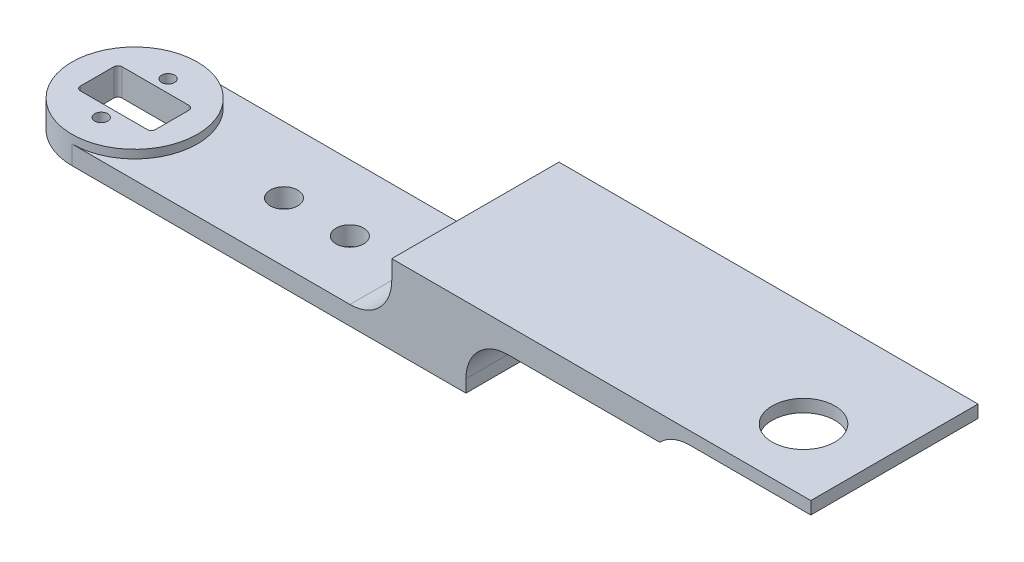
ISO-10303-21;
HEADER;
FILE_DESCRIPTION(('STEP AP214'),'2;1');
FILE_NAME('part.step','',(''),(''),'','','');
FILE_SCHEMA(('AUTOMOTIVE_DESIGN { 1 0 10303 214 1 1 1 1 }'));
ENDSEC;
DATA;
#1=APPLICATION_CONTEXT('core data for automotive mechanical design processes');
#2=APPLICATION_PROTOCOL_DEFINITION('international standard','automotive_design',2000,#1);
#3=PRODUCT_CONTEXT('',#1,'mechanical');
#4=PRODUCT('Part','Part','',(#3));
#5=PRODUCT_RELATED_PRODUCT_CATEGORY('part','',(#4));
#6=PRODUCT_DEFINITION_FORMATION('','',#4);
#7=PRODUCT_DEFINITION_CONTEXT('part definition',#1,'design');
#8=PRODUCT_DEFINITION('design','',#6,#7);
#9=PRODUCT_DEFINITION_SHAPE('','',#8);
#10=(LENGTH_UNIT() NAMED_UNIT(*) SI_UNIT(.MILLI.,.METRE.));
#11=(NAMED_UNIT(*) PLANE_ANGLE_UNIT() SI_UNIT($,.RADIAN.));
#12=(NAMED_UNIT(*) SI_UNIT($,.STERADIAN.) SOLID_ANGLE_UNIT());
#13=UNCERTAINTY_MEASURE_WITH_UNIT(LENGTH_MEASURE(1.E-05),#10,'distance_accuracy_value','');
#14=(GEOMETRIC_REPRESENTATION_CONTEXT(3) GLOBAL_UNCERTAINTY_ASSIGNED_CONTEXT((#13)) GLOBAL_UNIT_ASSIGNED_CONTEXT((#10,
#11,#12)) REPRESENTATION_CONTEXT('',''));
#15=CARTESIAN_POINT('',(0.,0.,0.));
#16=DIRECTION('',(0.,0.,1.));
#17=DIRECTION('',(1.,0.,0.));
#18=AXIS2_PLACEMENT_3D('',#15,#16,#17);
#19=CARTESIAN_POINT('',(-78.0013072163729,-18.5530526473976,147.487506354902));
#20=DIRECTION('',(0.,1.,1.36566002242615E-12));
#21=DIRECTION('',(1.,0.,0.));
#22=AXIS2_PLACEMENT_3D('',#19,#20,#21);
#23=PLANE('',#22);
#24=CARTESIAN_POINT('',(-25.6970909577959,-18.5530526473987,148.317146574787));
#25=DIRECTION('',(0.,-1.,-1.36566002242615E-12));
#26=DIRECTION('',(-1.,0.,0.));
#27=AXIS2_PLACEMENT_3D('',#24,#25,#26);
#28=CIRCLE('',#27,3.3);
#29=CARTESIAN_POINT('',(-28.9970909577959,-18.5530526473987,148.317146574787));
#30=VERTEX_POINT('',#29);
#31=EDGE_CURVE('E618',#30,#30,#28,.T.);
#32=ORIENTED_EDGE('',*,*,#31,.F.);
#33=EDGE_LOOP('',(#32));
#34=FACE_BOUND('',#33,.T.);
#35=CARTESIAN_POINT('',(-41.4543417426524,-18.5530526473987,148.317146574787));
#36=DIRECTION('',(0.,-1.,-1.36566002242615E-12));
#37=DIRECTION('',(-1.,0.,0.));
#38=AXIS2_PLACEMENT_3D('',#35,#36,#37);
#39=CIRCLE('',#38,3.30000000000001);
#40=CARTESIAN_POINT('',(-44.7543417426524,-18.5530526473987,148.317146574787));
#41=VERTEX_POINT('',#40);
#42=EDGE_CURVE('E383',#41,#41,#39,.T.);
#43=ORIENTED_EDGE('',*,*,#42,.F.);
#44=EDGE_LOOP('',(#43));
#45=FACE_BOUND('',#44,.T.);
#46=CARTESIAN_POINT('',(-78.0013072163729,-18.5530526473867,139.487506354902));
#47=DIRECTION('',(0.,-1.,-1.36566002242615E-12));
#48=DIRECTION('',(-1.,0.,0.));
#49=AXIS2_PLACEMENT_3D('',#46,#47,#48);
#50=CIRCLE('',#49,1.54999999999999);
#51=CARTESIAN_POINT('',(-79.5513072163729,-18.5530526473867,139.487506354902));
#52=VERTEX_POINT('',#51);
#53=EDGE_CURVE('E491',#52,#52,#50,.T.);
#54=ORIENTED_EDGE('',*,*,#53,.F.);
#55=EDGE_LOOP('',(#54));
#56=FACE_BOUND('',#55,.T.);
#57=CARTESIAN_POINT('',(-78.0013072163729,-18.5530526474085,155.487506354902));
#58=DIRECTION('',(0.,-1.,-1.36566002242615E-12));
#59=DIRECTION('',(1.,0.,0.));
#60=AXIS2_PLACEMENT_3D('',#57,#58,#59);
#61=CIRCLE('',#60,1.54999999999999);
#62=CARTESIAN_POINT('',(-76.4513072163729,-18.5530526474085,155.487506354902));
#63=VERTEX_POINT('',#62);
#64=EDGE_CURVE('E591',#63,#63,#61,.T.);
#65=ORIENTED_EDGE('',*,*,#64,.F.);
#66=EDGE_LOOP('',(#65));
#67=FACE_BOUND('',#66,.T.);
#68=CARTESIAN_POINT('',(-70.0013072163729,-18.553052647403,151.487506354902));
#69=DIRECTION('',(0.,-1.,-1.36566002242615E-12));
#70=DIRECTION('',(1.,0.,0.));
#71=AXIS2_PLACEMENT_3D('',#68,#69,#70);
#72=CIRCLE('',#71,1.);
#73=CARTESIAN_POINT('',(-69.0013072163729,-18.553052647403,151.487506354902));
#74=VERTEX_POINT('',#73);
#75=CARTESIAN_POINT('',(-70.0013072163729,-18.5530526474044,152.487506354902));
#76=VERTEX_POINT('',#75);
#77=EDGE_CURVE('E525',#74,#76,#72,.T.);
#78=ORIENTED_EDGE('',*,*,#77,.F.);
#79=DIRECTION('',(0.,-1.36566002242615E-12,1.));
#80=VECTOR('',#79,1.);
#81=CARTESIAN_POINT('',(-69.0013072163729,-18.553052647403,151.487506354902));
#82=LINE('',#81,#80);
#83=CARTESIAN_POINT('',(-69.0013072163729,-18.5530526473922,143.487506354902));
#84=VERTEX_POINT('',#83);
#85=EDGE_CURVE('E520',#84,#74,#82,.T.);
#86=ORIENTED_EDGE('',*,*,#85,.F.);
#87=CARTESIAN_POINT('',(-70.0013072163729,-18.5530526473922,143.487506354902));
#88=DIRECTION('',(0.,-1.,-1.36566002242615E-12));
#89=DIRECTION('',(1.,0.,0.));
#90=AXIS2_PLACEMENT_3D('',#87,#88,#89);
#91=CIRCLE('',#90,1.);
#92=CARTESIAN_POINT('',(-70.0013072163729,-18.5530526473907,142.487506354902));
#93=VERTEX_POINT('',#92);
#94=EDGE_CURVE('E513',#93,#84,#91,.T.);
#95=ORIENTED_EDGE('',*,*,#94,.F.);
#96=DIRECTION('',(1.,0.,0.));
#97=VECTOR('',#96,1.);
#98=CARTESIAN_POINT('',(-70.0013072163729,-18.5530526473907,142.487506354902));
#99=LINE('',#98,#97);
#100=CARTESIAN_POINT('',(-86.0013072163729,-18.5530526473907,142.487506354902));
#101=VERTEX_POINT('',#100);
#102=EDGE_CURVE('E509',#101,#93,#99,.T.);
#103=ORIENTED_EDGE('',*,*,#102,.F.);
#104=CARTESIAN_POINT('',(-86.0013072163729,-18.5530526473922,143.487506354902));
#105=DIRECTION('',(0.,-1.,-1.36566002242615E-12));
#106=DIRECTION('',(-1.,0.,0.));
#107=AXIS2_PLACEMENT_3D('',#104,#105,#106);
#108=CIRCLE('',#107,1.);
#109=CARTESIAN_POINT('',(-87.0013072163729,-18.5530526473922,143.487506354902));
#110=VERTEX_POINT('',#109);
#111=EDGE_CURVE('E505',#110,#101,#108,.T.);
#112=ORIENTED_EDGE('',*,*,#111,.F.);
#113=DIRECTION('',(0.,1.36566002242615E-12,-1.));
#114=VECTOR('',#113,1.);
#115=CARTESIAN_POINT('',(-87.0013072163729,-18.553052647403,151.487506354902));
#116=LINE('',#115,#114);
#117=CARTESIAN_POINT('',(-87.0013072163729,-18.553052647403,151.487506354902));
#118=VERTEX_POINT('',#117);
#119=EDGE_CURVE('E501',#118,#110,#116,.T.);
#120=ORIENTED_EDGE('',*,*,#119,.F.);
#121=CARTESIAN_POINT('',(-86.0013072163729,-18.553052647403,151.487506354902));
#122=DIRECTION('',(0.,-1.,-1.36566002242615E-12));
#123=DIRECTION('',(-1.,0.,0.));
#124=AXIS2_PLACEMENT_3D('',#121,#122,#123);
#125=CIRCLE('',#124,1.);
#126=CARTESIAN_POINT('',(-86.0013072163729,-18.5530526474044,152.487506354902));
#127=VERTEX_POINT('',#126);
#128=EDGE_CURVE('E497',#127,#118,#125,.T.);
#129=ORIENTED_EDGE('',*,*,#128,.F.);
#130=DIRECTION('',(-1.,0.,0.));
#131=VECTOR('',#130,1.);
#132=CARTESIAN_POINT('',(-70.0013072163729,-18.5530526474044,152.487506354902));
#133=LINE('',#132,#131);
#134=EDGE_CURVE('E496',#76,#127,#133,.T.);
#135=ORIENTED_EDGE('',*,*,#134,.F.);
#136=EDGE_LOOP('',(#78,#86,#95,#103,#112,#120,#129,#135));
#137=FACE_BOUND('',#136,.T.);
#138=DIRECTION('',(1.,0.,0.));
#139=VECTOR('',#138,1.);
#140=CARTESIAN_POINT('',(70.,-18.5530526473634,122.487506354902));
#141=LINE('',#140,#139);
#142=CARTESIAN_POINT('',(-1.50130721637287,-18.5530526473634,122.487506354902));
#143=VERTEX_POINT('',#142);
#144=CARTESIAN_POINT('',(16.2448112914227,-18.5530526473634,122.487506354902));
#145=VERTEX_POINT('',#144);
#146=EDGE_CURVE('E404',#143,#145,#141,.T.);
#147=ORIENTED_EDGE('',*,*,#146,.T.);
#148=DIRECTION('',(0.,1.36566002242615E-12,-1.));
#149=VECTOR('',#148,1.);
#150=CARTESIAN_POINT('',(16.2448112914227,-18.5530526484562,922.649453707506));
#151=LINE('',#150,#149);
#152=CARTESIAN_POINT('',(16.2448112914227,-18.553052647418,162.487506354902));
#153=VERTEX_POINT('',#152);
#154=EDGE_CURVE('E374',#153,#145,#151,.T.);
#155=ORIENTED_EDGE('',*,*,#154,.F.);
#156=DIRECTION('',(-1.,0.,0.));
#157=VECTOR('',#156,1.);
#158=CARTESIAN_POINT('',(-78.0013072163729,-18.553052647418,162.487506354902));
#159=LINE('',#158,#157);
#160=CARTESIAN_POINT('',(-78.0013072163729,-18.553052647418,162.487506354902));
#161=VERTEX_POINT('',#160);
#162=EDGE_CURVE('E458',#153,#161,#159,.T.);
#163=ORIENTED_EDGE('',*,*,#162,.T.);
#164=CARTESIAN_POINT('',(-78.0013072163729,-18.5530526473976,147.487506354902));
#165=DIRECTION('',(0.,-1.,-1.36566002242615E-12));
#166=DIRECTION('',(1.,0.,0.));
#167=AXIS2_PLACEMENT_3D('',#164,#165,#166);
#168=CIRCLE('',#167,15.);
#169=CARTESIAN_POINT('',(-78.0013072163729,-18.5530526473771,132.487506354902));
#170=VERTEX_POINT('',#169);
#171=EDGE_CURVE('E563',#161,#170,#168,.T.);
#172=ORIENTED_EDGE('',*,*,#171,.T.);
#173=DIRECTION('',(1.,0.,0.));
#174=VECTOR('',#173,1.);
#175=CARTESIAN_POINT('',(-78.0013072163729,-18.5530526473771,132.487506354902));
#176=LINE('',#175,#174);
#177=CARTESIAN_POINT('',(-11.5013072163729,-18.5530526473771,132.487506354902));
#178=VERTEX_POINT('',#177);
#179=EDGE_CURVE('E454',#170,#178,#176,.T.);
#180=ORIENTED_EDGE('',*,*,#179,.T.);
#181=CARTESIAN_POINT('',(-11.5013072163729,-18.5530526473634,122.487506354902));
#182=DIRECTION('',(0.,1.,1.36566002242615E-12));
#183=DIRECTION('',(1.,0.,0.));
#184=AXIS2_PLACEMENT_3D('',#181,#182,#183);
#185=CIRCLE('',#184,10.);
#186=EDGE_CURVE('E443',#178,#143,#185,.T.);
#187=ORIENTED_EDGE('',*,*,#186,.T.);
#188=EDGE_LOOP('',(#147,#155,#163,#172,#180,#187));
#189=FACE_BOUND('',#188,.T.);
#190=ADVANCED_FACE('F202',(#34,#45,#56,#67,#137,#189),#23,.F.);
#191=CARTESIAN_POINT('',(101.998692783627,-13.5530526474181,162.487506354909));
#192=DIRECTION('',(0.,1.36566002242615E-12,-1.));
#193=DIRECTION('',(0.,1.,1.36566002242615E-12));
#194=AXIS2_PLACEMENT_3D('',#191,#192,#193);
#195=PLANE('',#194);
#196=ORIENTED_EDGE('',*,*,#162,.F.);
#197=DIRECTION('',(0.,-1.,-1.36566002242614E-12));
#198=VECTOR('',#197,1.);
#199=CARTESIAN_POINT('',(16.2448112914227,-5.55305264741812,162.48750635492));
#200=LINE('',#199,#198);
#201=CARTESIAN_POINT('',(16.2448112914227,-15.5530526474181,162.487506354906));
#202=VERTEX_POINT('',#201);
#203=EDGE_CURVE('E368',#202,#153,#200,.T.);
#204=ORIENTED_EDGE('',*,*,#203,.F.);
#205=CARTESIAN_POINT('',(26.2448112914227,-15.5530526474181,162.487506354906));
#206=DIRECTION('',(0.,1.36566002242615E-12,-1.));
#207=DIRECTION('',(0.,1.,1.36566002242615E-12));
#208=AXIS2_PLACEMENT_3D('',#205,#206,#207);
#209=CIRCLE('',#208,10.);
#210=CARTESIAN_POINT('',(26.2448112914227,-5.55305264741812,162.48750635492));
#211=VERTEX_POINT('',#210);
#212=EDGE_CURVE('E12',#202,#211,#209,.T.);
#213=ORIENTED_EDGE('',*,*,#212,.T.);
#214=DIRECTION('',(-1.,0.,0.));
#215=VECTOR('',#214,1.);
#216=CARTESIAN_POINT('',(70.0000000000001,-5.55305264741812,162.48750635492));
#217=LINE('',#216,#215);
#218=CARTESIAN_POINT('',(62.5891019136799,-5.55305264741812,162.48750635492));
#219=VERTEX_POINT('',#218);
#220=EDGE_CURVE('E364',#219,#211,#217,.T.);
#221=ORIENTED_EDGE('',*,*,#220,.F.);
#222=CARTESIAN_POINT('',(69.7305303422227,-12.553052647418,162.48750635491));
#223=DIRECTION('',(0.,1.36566002242615E-12,-1.));
#224=DIRECTION('',(0.,1.,1.36566002242615E-12));
#225=AXIS2_PLACEMENT_3D('',#222,#223,#224);
#226=CIRCLE('',#225,10.);
#227=CARTESIAN_POINT('',(69.7305303422227,-2.55305264741812,162.487506354924));
#228=VERTEX_POINT('',#227);
#229=EDGE_CURVE('E346',#219,#228,#226,.T.);
#230=ORIENTED_EDGE('',*,*,#229,.T.);
#231=DIRECTION('',(-1.,0.,0.));
#232=VECTOR('',#231,1.);
#233=CARTESIAN_POINT('',(70.0000000000001,-2.55305264741812,162.487506354924));
#234=LINE('',#233,#232);
#235=CARTESIAN_POINT('',(98.7380506702503,-2.55305264741812,162.487506354924));
#236=VERTEX_POINT('',#235);
#237=EDGE_CURVE('E397',#236,#228,#234,.T.);
#238=ORIENTED_EDGE('',*,*,#237,.F.);
#239=DIRECTION('',(0.,-1.,-1.36566002242615E-12));
#240=VECTOR('',#239,1.);
#241=CARTESIAN_POINT('',(98.7380506702503,0.446947352581883,162.487506354928));
#242=LINE('',#241,#240);
#243=CARTESIAN_POINT('',(98.7380506702503,0.446947352581883,162.487506354928));
#244=VERTEX_POINT('',#243);
#245=EDGE_CURVE('E431',#244,#236,#242,.T.);
#246=ORIENTED_EDGE('',*,*,#245,.F.);
#247=DIRECTION('',(1.,0.,0.));
#248=VECTOR('',#247,1.);
#249=CARTESIAN_POINT('',(70.,0.446947352581883,162.487506354928));
#250=LINE('',#249,#248);
#251=CARTESIAN_POINT('',(-1.50130721637287,0.446947352581883,162.487506354928));
#252=VERTEX_POINT('',#251);
#253=EDGE_CURVE('E417',#252,#244,#250,.T.);
#254=ORIENTED_EDGE('',*,*,#253,.F.);
#255=DIRECTION('',(0.,-1.,-1.36566002242615E-12));
#256=VECTOR('',#255,1.);
#257=CARTESIAN_POINT('',(-1.50130721637287,0.446947352581883,162.487506354928));
#258=LINE('',#257,#256);
#259=CARTESIAN_POINT('',(-1.50130721637287,-4.05305264741807,162.487506354922));
#260=VERTEX_POINT('',#259);
#261=EDGE_CURVE('E435',#252,#260,#258,.T.);
#262=ORIENTED_EDGE('',*,*,#261,.T.);
#263=CARTESIAN_POINT('',(-11.5013072163729,-4.05305264741807,162.487506354922));
#264=DIRECTION('',(0.,1.36566002242615E-12,-1.));
#265=DIRECTION('',(0.,1.,1.36566002242615E-12));
#266=AXIS2_PLACEMENT_3D('',#263,#264,#265);
#267=CIRCLE('',#266,10.);
#268=CARTESIAN_POINT('',(-11.5013072163729,-14.0530526474181,162.487506354908));
#269=VERTEX_POINT('',#268);
#270=EDGE_CURVE('E450',#260,#269,#267,.T.);
#271=ORIENTED_EDGE('',*,*,#270,.T.);
#272=DIRECTION('',(1.,0.,0.));
#273=VECTOR('',#272,1.);
#274=CARTESIAN_POINT('',(-1.50130721637287,-14.0530526474181,162.487506354908));
#275=LINE('',#274,#273);
#276=CARTESIAN_POINT('',(-78.0013072163729,-14.0530526474181,162.487506354908));
#277=VERTEX_POINT('',#276);
#278=EDGE_CURVE('E463',#277,#269,#275,.T.);
#279=ORIENTED_EDGE('',*,*,#278,.F.);
#280=DIRECTION('',(0.,-1.,-1.36566002242615E-12));
#281=VECTOR('',#280,1.);
#282=CARTESIAN_POINT('',(-78.0013072163729,-12.0530526474181,162.487506354911));
#283=LINE('',#282,#281);
#284=EDGE_CURVE('E453',#277,#161,#283,.T.);
#285=ORIENTED_EDGE('',*,*,#284,.T.);
#286=EDGE_LOOP('',(#196,#204,#213,#221,#230,#238,#246,#254,#262,#271,#279,#285));
#287=FACE_BOUND('',#286,.T.);
#288=ADVANCED_FACE('F371',(#287),#195,.F.);
#289=CARTESIAN_POINT('',(70.,0.446947352636506,122.487506354928));
#290=DIRECTION('',(0.,1.36566002242615E-12,-1.));
#291=DIRECTION('',(0.,1.,1.36566002242615E-12));
#292=AXIS2_PLACEMENT_3D('',#289,#290,#291);
#293=PLANE('',#292);
#294=DIRECTION('',(1.,0.,0.));
#295=VECTOR('',#294,1.);
#296=CARTESIAN_POINT('',(70.,-5.5530526473635,122.48750635492));
#297=LINE('',#296,#295);
#298=CARTESIAN_POINT('',(26.2448112914227,-5.5530526473635,122.48750635492));
#299=VERTEX_POINT('',#298);
#300=CARTESIAN_POINT('',(62.5891019136799,-5.5530526473635,122.48750635492));
#301=VERTEX_POINT('',#300);
#302=EDGE_CURVE('E366',#299,#301,#297,.T.);
#303=ORIENTED_EDGE('',*,*,#302,.F.);
#304=CARTESIAN_POINT('',(26.2448112914227,-15.5530526473635,122.487506354906));
#305=DIRECTION('',(0.,1.36566002242615E-12,-1.));
#306=DIRECTION('',(0.,1.,1.36566002242615E-12));
#307=AXIS2_PLACEMENT_3D('',#304,#305,#306);
#308=CIRCLE('',#307,10.);
#309=CARTESIAN_POINT('',(16.2448112914227,-15.5530526473635,122.487506354906));
#310=VERTEX_POINT('',#309);
#311=EDGE_CURVE('E212',#299,#310,#308,.F.);
#312=ORIENTED_EDGE('',*,*,#311,.T.);
#313=DIRECTION('',(0.,-1.,-1.36566002242614E-12));
#314=VECTOR('',#313,1.);
#315=CARTESIAN_POINT('',(16.2448112914227,-5.5530526473635,122.48750635492));
#316=LINE('',#315,#314);
#317=EDGE_CURVE('E386',#310,#145,#316,.T.);
#318=ORIENTED_EDGE('',*,*,#317,.T.);
#319=ORIENTED_EDGE('',*,*,#146,.F.);
#320=DIRECTION('',(0.,-1.,-1.36566002242615E-12));
#321=VECTOR('',#320,1.);
#322=CARTESIAN_POINT('',(-1.50130721637287,-14.0530526473635,122.487506354908));
#323=LINE('',#322,#321);
#324=CARTESIAN_POINT('',(-1.50130721637287,-4.05305264736344,122.487506354922));
#325=VERTEX_POINT('',#324);
#326=EDGE_CURVE('E464',#143,#325,#323,.F.);
#327=ORIENTED_EDGE('',*,*,#326,.T.);
#328=DIRECTION('',(0.,-1.,-1.36566002242615E-12));
#329=VECTOR('',#328,1.);
#330=CARTESIAN_POINT('',(-1.50130721637287,0.446947352636506,122.487506354928));
#331=LINE('',#330,#329);
#332=CARTESIAN_POINT('',(-1.50130721637287,0.446947352636506,122.487506354928));
#333=VERTEX_POINT('',#332);
#334=EDGE_CURVE('E439',#333,#325,#331,.T.);
#335=ORIENTED_EDGE('',*,*,#334,.F.);
#336=DIRECTION('',(1.,0.,0.));
#337=VECTOR('',#336,1.);
#338=CARTESIAN_POINT('',(70.,0.446947352636506,122.487506354928));
#339=LINE('',#338,#337);
#340=CARTESIAN_POINT('',(98.7380506702503,0.446947352636506,122.487506354928));
#341=VERTEX_POINT('',#340);
#342=EDGE_CURVE('E409',#333,#341,#339,.T.);
#343=ORIENTED_EDGE('',*,*,#342,.T.);
#344=DIRECTION('',(0.,-1.,-1.36566002242615E-12));
#345=VECTOR('',#344,1.);
#346=CARTESIAN_POINT('',(98.7380506702503,0.446947352636506,122.487506354928));
#347=LINE('',#346,#345);
#348=CARTESIAN_POINT('',(98.7380506702503,-2.55305264736339,122.487506354924));
#349=VERTEX_POINT('',#348);
#350=EDGE_CURVE('E424',#341,#349,#347,.T.);
#351=ORIENTED_EDGE('',*,*,#350,.T.);
#352=DIRECTION('',(1.,0.,0.));
#353=VECTOR('',#352,1.);
#354=CARTESIAN_POINT('',(70.,-2.55305264736339,122.487506354924));
#355=LINE('',#354,#353);
#356=CARTESIAN_POINT('',(69.7305303422227,-2.55305264736339,122.487506354924));
#357=VERTEX_POINT('',#356);
#358=EDGE_CURVE('E389',#357,#349,#355,.T.);
#359=ORIENTED_EDGE('',*,*,#358,.F.);
#360=CARTESIAN_POINT('',(69.7305303422227,-12.5530526473634,122.48750635491));
#361=DIRECTION('',(0.,1.36566002242615E-12,-1.));
#362=DIRECTION('',(0.,1.,1.36566002242615E-12));
#363=AXIS2_PLACEMENT_3D('',#360,#361,#362);
#364=CIRCLE('',#363,10.);
#365=EDGE_CURVE('E357',#357,#301,#364,.F.);
#366=ORIENTED_EDGE('',*,*,#365,.T.);
#367=EDGE_LOOP('',(#303,#312,#318,#319,#327,#335,#343,#351,#359,#366));
#368=FACE_BOUND('',#367,.T.);
#369=ADVANCED_FACE('F651',(#368),#293,.T.);
#370=CARTESIAN_POINT('',(81.9986927836271,0.446947352602423,147.487506354928));
#371=DIRECTION('',(0.,-1.,-1.36566002242615E-12));
#372=DIRECTION('',(-1.,0.,0.));
#373=AXIS2_PLACEMENT_3D('',#370,#371,#372);
#374=CYLINDRICAL_SURFACE('',#373,7.5);
#375=CARTESIAN_POINT('',(81.9986927836271,0.446947352602423,147.487506354928));
#376=DIRECTION('',(0.,1.,1.36566002242615E-12));
#377=DIRECTION('',(1.,0.,0.));
#378=AXIS2_PLACEMENT_3D('',#375,#376,#377);
#379=CIRCLE('',#378,7.5);
#380=CARTESIAN_POINT('',(89.4986927836271,0.446947352602423,147.487506354928));
#381=VERTEX_POINT('',#380);
#382=EDGE_CURVE('E405',#381,#381,#379,.T.);
#383=ORIENTED_EDGE('',*,*,#382,.T.);
#384=EDGE_LOOP('',(#383));
#385=FACE_BOUND('',#384,.T.);
#386=CARTESIAN_POINT('',(81.9986927836271,-2.55305264739758,147.487506354924));
#387=DIRECTION('',(0.,-1.,-1.36566002242615E-12));
#388=DIRECTION('',(-1.,0.,0.));
#389=AXIS2_PLACEMENT_3D('',#386,#387,#388);
#390=CIRCLE('',#389,7.5);
#391=CARTESIAN_POINT('',(74.4986927836271,-2.55305264739758,147.487506354924));
#392=VERTEX_POINT('',#391);
#393=EDGE_CURVE('E400',#392,#392,#390,.F.);
#394=ORIENTED_EDGE('',*,*,#393,.F.);
#395=EDGE_LOOP('',(#394));
#396=FACE_BOUND('',#395,.T.);
#397=ADVANCED_FACE('F723',(#385,#396),#374,.F.);
#398=CARTESIAN_POINT('',(98.7380506702503,0.446947351543825,922.649453707532));
#399=DIRECTION('',(1.,0.,0.));
#400=DIRECTION('',(0.,-1.,-1.36566002242615E-12));
#401=AXIS2_PLACEMENT_3D('',#398,#399,#400);
#402=PLANE('',#401);
#403=ORIENTED_EDGE('',*,*,#245,.T.);
#404=DIRECTION('',(0.,-1.36566002242615E-12,1.));
#405=VECTOR('',#404,1.);
#406=CARTESIAN_POINT('',(98.7380506702503,-2.55305264845618,922.649453707528));
#407=LINE('',#406,#405);
#408=EDGE_CURVE('E394',#349,#236,#407,.T.);
#409=ORIENTED_EDGE('',*,*,#408,.F.);
#410=ORIENTED_EDGE('',*,*,#350,.F.);
#411=DIRECTION('',(0.,-1.36566002242615E-12,1.));
#412=VECTOR('',#411,1.);
#413=CARTESIAN_POINT('',(98.7380506702503,0.446947351543825,922.649453707532));
#414=LINE('',#413,#412);
#415=EDGE_CURVE('E420',#341,#244,#414,.T.);
#416=ORIENTED_EDGE('',*,*,#415,.T.);
#417=EDGE_LOOP('',(#403,#409,#410,#416));
#418=FACE_BOUND('',#417,.T.);
#419=ADVANCED_FACE('F660',(#418),#402,.T.);
#420=CARTESIAN_POINT('',(-78.0013072163729,-12.0530526473771,132.487506354911));
#421=DIRECTION('',(0.,1.36566002242615E-12,-1.));
#422=DIRECTION('',(-1.,0.,0.));
#423=AXIS2_PLACEMENT_3D('',#420,#421,#422);
#424=PLANE('',#423);
#425=DIRECTION('',(-1.,0.,0.));
#426=VECTOR('',#425,1.);
#427=CARTESIAN_POINT('',(-78.0013072163729,-14.0530526473771,132.487506354908));
#428=LINE('',#427,#426);
#429=CARTESIAN_POINT('',(-11.5013072163729,-14.0530526473771,132.487506354908));
#430=VERTEX_POINT('',#429);
#431=CARTESIAN_POINT('',(-78.0013072163729,-14.0530526473771,132.487506354908));
#432=VERTEX_POINT('',#431);
#433=EDGE_CURVE('E462',#430,#432,#428,.T.);
#434=ORIENTED_EDGE('',*,*,#433,.F.);
#435=DIRECTION('',(0.,-1.,-1.36566002242615E-12));
#436=VECTOR('',#435,1.);
#437=CARTESIAN_POINT('',(-11.5013072163729,-18.5530526473771,132.487506354902));
#438=LINE('',#437,#436);
#439=EDGE_CURVE('E471',#430,#178,#438,.T.);
#440=ORIENTED_EDGE('',*,*,#439,.T.);
#441=ORIENTED_EDGE('',*,*,#179,.F.);
#442=DIRECTION('',(0.,-1.,-1.36566002242615E-12));
#443=VECTOR('',#442,1.);
#444=CARTESIAN_POINT('',(-78.0013072163729,-12.0530526473771,132.487506354911));
#445=LINE('',#444,#443);
#446=EDGE_CURVE('E475',#432,#170,#445,.T.);
#447=ORIENTED_EDGE('',*,*,#446,.F.);
#448=EDGE_LOOP('',(#434,#440,#441,#447));
#449=FACE_BOUND('',#448,.T.);
#450=ADVANCED_FACE('F680',(#449),#424,.T.);
#451=CARTESIAN_POINT('',(-78.0013072163729,-12.0530526473975,147.487506354911));
#452=DIRECTION('',(0.,-1.,-1.36566002242615E-12));
#453=DIRECTION('',(-1.,0.,0.));
#454=AXIS2_PLACEMENT_3D('',#451,#452,#453);
#455=CYLINDRICAL_SURFACE('',#454,15.);
#456=CARTESIAN_POINT('',(-78.0013072163729,-14.0530526473975,147.487506354908));
#457=DIRECTION('',(0.,-1.,-1.36566002242615E-12));
#458=DIRECTION('',(-1.,0.,0.));
#459=AXIS2_PLACEMENT_3D('',#456,#457,#458);
#460=CIRCLE('',#459,14.9999999999999);
#461=EDGE_CURVE('E449',#432,#277,#460,.T.);
#462=ORIENTED_EDGE('',*,*,#461,.F.);
#463=ORIENTED_EDGE('',*,*,#446,.T.);
#464=ORIENTED_EDGE('',*,*,#171,.F.);
#465=ORIENTED_EDGE('',*,*,#284,.F.);
#466=EDGE_LOOP('',(#462,#463,#464,#465));
#467=FACE_BOUND('',#466,.T.);
#468=CARTESIAN_POINT('',(-78.0013072163729,-12.0530526473975,147.487506354911));
#469=DIRECTION('',(0.,-1.,-1.36566002242615E-12));
#470=DIRECTION('',(1.,0.,0.));
#471=AXIS2_PLACEMENT_3D('',#468,#469,#470);
#472=CIRCLE('',#471,15.);
#473=CARTESIAN_POINT('',(-63.0013072163729,-12.0530526473975,147.487506354911));
#474=VERTEX_POINT('',#473);
#475=EDGE_CURVE('E482',#474,#474,#472,.T.);
#476=ORIENTED_EDGE('',*,*,#475,.T.);
#477=EDGE_LOOP('',(#476));
#478=FACE_BOUND('',#477,.T.);
#479=ADVANCED_FACE('F686',(#467,#478),#455,.T.);
#480=CARTESIAN_POINT('',(-78.0013072163729,-12.0530526473975,147.487506354911));
#481=DIRECTION('',(0.,1.,1.36566002242615E-12));
#482=DIRECTION('',(1.,0.,0.));
#483=AXIS2_PLACEMENT_3D('',#480,#481,#482);
#484=PLANE('',#483);
#485=ORIENTED_EDGE('',*,*,#475,.F.);
#486=EDGE_LOOP('',(#485));
#487=FACE_BOUND('',#486,.T.);
#488=CARTESIAN_POINT('',(-78.0013072163729,-12.0530526474085,155.487506354911));
#489=DIRECTION('',(0.,-1.,-1.36566002242615E-12));
#490=DIRECTION('',(1.,0.,0.));
#491=AXIS2_PLACEMENT_3D('',#488,#489,#490);
#492=CIRCLE('',#491,1.54999999999999);
#493=CARTESIAN_POINT('',(-76.4513072163729,-12.0530526474085,155.487506354911));
#494=VERTEX_POINT('',#493);
#495=EDGE_CURVE('E486',#494,#494,#492,.T.);
#496=ORIENTED_EDGE('',*,*,#495,.T.);
#497=EDGE_LOOP('',(#496));
#498=FACE_BOUND('',#497,.T.);
#499=CARTESIAN_POINT('',(-70.0013072163729,-12.053052647403,151.487506354911));
#500=DIRECTION('',(0.,-1.,-1.36566002242615E-12));
#501=DIRECTION('',(1.,0.,0.));
#502=AXIS2_PLACEMENT_3D('',#499,#500,#501);
#503=CIRCLE('',#502,1.);
#504=CARTESIAN_POINT('',(-69.0013072163729,-12.053052647403,151.487506354911));
#505=VERTEX_POINT('',#504);
#506=CARTESIAN_POINT('',(-70.0013072163729,-12.0530526474044,152.487506354911));
#507=VERTEX_POINT('',#506);
#508=EDGE_CURVE('E553',#505,#507,#503,.T.);
#509=ORIENTED_EDGE('',*,*,#508,.T.);
#510=DIRECTION('',(-1.,0.,0.));
#511=VECTOR('',#510,1.);
#512=CARTESIAN_POINT('',(-70.0013072163729,-12.0530526474044,152.487506354911));
#513=LINE('',#512,#511);
#514=CARTESIAN_POINT('',(-86.0013072163729,-12.0530526474044,152.487506354911));
#515=VERTEX_POINT('',#514);
#516=EDGE_CURVE('E549',#507,#515,#513,.T.);
#517=ORIENTED_EDGE('',*,*,#516,.T.);
#518=CARTESIAN_POINT('',(-86.0013072163729,-12.053052647403,151.487506354911));
#519=DIRECTION('',(0.,-1.,-1.36566002242615E-12));
#520=DIRECTION('',(-1.,0.,0.));
#521=AXIS2_PLACEMENT_3D('',#518,#519,#520);
#522=CIRCLE('',#521,1.);
#523=CARTESIAN_POINT('',(-87.0013072163729,-12.053052647403,151.487506354911));
#524=VERTEX_POINT('',#523);
#525=EDGE_CURVE('E545',#515,#524,#522,.T.);
#526=ORIENTED_EDGE('',*,*,#525,.T.);
#527=DIRECTION('',(0.,1.36566002242615E-12,-1.));
#528=VECTOR('',#527,1.);
#529=CARTESIAN_POINT('',(-87.0013072163729,-12.053052647403,151.487506354911));
#530=LINE('',#529,#528);
#531=CARTESIAN_POINT('',(-87.0013072163729,-12.0530526473921,143.487506354911));
#532=VERTEX_POINT('',#531);
#533=EDGE_CURVE('E541',#524,#532,#530,.T.);
#534=ORIENTED_EDGE('',*,*,#533,.T.);
#535=CARTESIAN_POINT('',(-86.0013072163729,-12.0530526473921,143.487506354911));
#536=DIRECTION('',(0.,-1.,-1.36566002242615E-12));
#537=DIRECTION('',(-1.,0.,0.));
#538=AXIS2_PLACEMENT_3D('',#535,#536,#537);
#539=CIRCLE('',#538,1.);
#540=CARTESIAN_POINT('',(-86.0013072163729,-12.0530526473908,142.487506354911));
#541=VERTEX_POINT('',#540);
#542=EDGE_CURVE('E537',#532,#541,#539,.T.);
#543=ORIENTED_EDGE('',*,*,#542,.T.);
#544=DIRECTION('',(1.,0.,0.));
#545=VECTOR('',#544,1.);
#546=CARTESIAN_POINT('',(-70.0013072163729,-12.0530526473908,142.487506354911));
#547=LINE('',#546,#545);
#548=CARTESIAN_POINT('',(-70.0013072163729,-12.0530526473908,142.487506354911));
#549=VERTEX_POINT('',#548);
#550=EDGE_CURVE('E533',#541,#549,#547,.T.);
#551=ORIENTED_EDGE('',*,*,#550,.T.);
#552=CARTESIAN_POINT('',(-70.0013072163729,-12.0530526473921,143.487506354911));
#553=DIRECTION('',(0.,-1.,-1.36566002242615E-12));
#554=DIRECTION('',(1.,0.,0.));
#555=AXIS2_PLACEMENT_3D('',#552,#553,#554);
#556=CIRCLE('',#555,1.);
#557=CARTESIAN_POINT('',(-69.0013072163729,-12.0530526473921,143.487506354911));
#558=VERTEX_POINT('',#557);
#559=EDGE_CURVE('E529',#549,#558,#556,.T.);
#560=ORIENTED_EDGE('',*,*,#559,.T.);
#561=DIRECTION('',(0.,-1.36566002242615E-12,1.));
#562=VECTOR('',#561,1.);
#563=CARTESIAN_POINT('',(-69.0013072163729,-12.053052647403,151.487506354911));
#564=LINE('',#563,#562);
#565=EDGE_CURVE('E492',#558,#505,#564,.T.);
#566=ORIENTED_EDGE('',*,*,#565,.T.);
#567=EDGE_LOOP('',(#509,#517,#526,#534,#543,#551,#560,#566));
#568=FACE_BOUND('',#567,.T.);
#569=CARTESIAN_POINT('',(-78.0013072163729,-12.0530526473867,139.487506354911));
#570=DIRECTION('',(0.,-1.,-1.36566002242615E-12));
#571=DIRECTION('',(-1.,0.,0.));
#572=AXIS2_PLACEMENT_3D('',#569,#570,#571);
#573=CIRCLE('',#572,1.54999999999999);
#574=CARTESIAN_POINT('',(-79.5513072163729,-12.0530526473867,139.487506354911));
#575=VERTEX_POINT('',#574);
#576=EDGE_CURVE('E487',#575,#575,#573,.T.);
#577=ORIENTED_EDGE('',*,*,#576,.T.);
#578=EDGE_LOOP('',(#577));
#579=FACE_BOUND('',#578,.T.);
#580=ADVANCED_FACE('F737',(#487,#498,#568,#579),#484,.T.);
#581=CARTESIAN_POINT('',(-78.0013072163729,-12.0530526473867,139.487506354911));
#582=DIRECTION('',(0.,-1.,-1.36566002242615E-12));
#583=DIRECTION('',(-1.,0.,0.));
#584=AXIS2_PLACEMENT_3D('',#581,#582,#583);
#585=CYLINDRICAL_SURFACE('',#584,1.54999999999999);
#586=ORIENTED_EDGE('',*,*,#576,.F.);
#587=EDGE_LOOP('',(#586));
#588=FACE_BOUND('',#587,.T.);
#589=ORIENTED_EDGE('',*,*,#53,.T.);
#590=EDGE_LOOP('',(#589));
#591=FACE_BOUND('',#590,.T.);
#592=ADVANCED_FACE('F742',(#588,#591),#585,.F.);
#593=CARTESIAN_POINT('',(-70.0013072163729,-12.053052647403,151.487506354911));
#594=DIRECTION('',(0.,-1.,-1.36566002242615E-12));
#595=DIRECTION('',(-1.,0.,0.));
#596=AXIS2_PLACEMENT_3D('',#593,#594,#595);
#597=CYLINDRICAL_SURFACE('',#596,1.);
#598=DIRECTION('',(0.,-1.,-1.36566002242615E-12));
#599=VECTOR('',#598,1.);
#600=CARTESIAN_POINT('',(-69.0013072163729,-12.053052647403,151.487506354911));
#601=LINE('',#600,#599);
#602=EDGE_CURVE('E521',#505,#74,#601,.T.);
#603=ORIENTED_EDGE('',*,*,#602,.T.);
#604=ORIENTED_EDGE('',*,*,#77,.T.);
#605=DIRECTION('',(0.,-1.,-1.36566002242615E-12));
#606=VECTOR('',#605,1.);
#607=CARTESIAN_POINT('',(-70.0013072163729,-12.0530526474044,152.487506354911));
#608=LINE('',#607,#606);
#609=EDGE_CURVE('E493',#507,#76,#608,.T.);
#610=ORIENTED_EDGE('',*,*,#609,.F.);
#611=ORIENTED_EDGE('',*,*,#508,.F.);
#612=EDGE_LOOP('',(#603,#604,#610,#611));
#613=FACE_BOUND('',#612,.T.);
#614=ADVANCED_FACE('F746',(#613),#597,.F.);
#615=CARTESIAN_POINT('',(-69.0013072163729,-12.053052647403,151.487506354911));
#616=DIRECTION('',(1.,0.,0.));
#617=DIRECTION('',(0.,-1.,-1.36566002242615E-12));
#618=AXIS2_PLACEMENT_3D('',#615,#616,#617);
#619=PLANE('',#618);
#620=ORIENTED_EDGE('',*,*,#85,.T.);
#621=ORIENTED_EDGE('',*,*,#602,.F.);
#622=ORIENTED_EDGE('',*,*,#565,.F.);
#623=DIRECTION('',(0.,-1.,-1.36566002242615E-12));
#624=VECTOR('',#623,1.);
#625=CARTESIAN_POINT('',(-69.0013072163729,-12.0530526473921,143.487506354911));
#626=LINE('',#625,#624);
#627=EDGE_CURVE('E517',#558,#84,#626,.T.);
#628=ORIENTED_EDGE('',*,*,#627,.T.);
#629=EDGE_LOOP('',(#620,#621,#622,#628));
#630=FACE_BOUND('',#629,.T.);
#631=ADVANCED_FACE('F750',(#630),#619,.F.);
#632=CARTESIAN_POINT('',(-70.0013072163729,-12.0530526473921,143.487506354911));
#633=DIRECTION('',(0.,-1.,-1.36566002242615E-12));
#634=DIRECTION('',(-1.,0.,0.));
#635=AXIS2_PLACEMENT_3D('',#632,#633,#634);
#636=CYLINDRICAL_SURFACE('',#635,1.);
#637=DIRECTION('',(0.,-1.,-1.36566002242615E-12));
#638=VECTOR('',#637,1.);
#639=CARTESIAN_POINT('',(-70.0013072163729,-12.0530526473908,142.487506354911));
#640=LINE('',#639,#638);
#641=EDGE_CURVE('E514',#549,#93,#640,.T.);
#642=ORIENTED_EDGE('',*,*,#641,.T.);
#643=ORIENTED_EDGE('',*,*,#94,.T.);
#644=ORIENTED_EDGE('',*,*,#627,.F.);
#645=ORIENTED_EDGE('',*,*,#559,.F.);
#646=EDGE_LOOP('',(#642,#643,#644,#645));
#647=FACE_BOUND('',#646,.T.);
#648=ADVANCED_FACE('F770',(#647),#636,.F.);
#649=CARTESIAN_POINT('',(-70.0013072163729,-12.0530526473908,142.487506354911));
#650=DIRECTION('',(0.,1.36566002242615E-12,-1.));
#651=DIRECTION('',(0.,1.,1.36566002242615E-12));
#652=AXIS2_PLACEMENT_3D('',#649,#650,#651);
#653=PLANE('',#652);
#654=DIRECTION('',(0.,-1.,-1.36566002242615E-12));
#655=VECTOR('',#654,1.);
#656=CARTESIAN_POINT('',(-86.0013072163729,-12.0530526473908,142.487506354911));
#657=LINE('',#656,#655);
#658=EDGE_CURVE('E510',#541,#101,#657,.T.);
#659=ORIENTED_EDGE('',*,*,#658,.T.);
#660=ORIENTED_EDGE('',*,*,#102,.T.);
#661=ORIENTED_EDGE('',*,*,#641,.F.);
#662=ORIENTED_EDGE('',*,*,#550,.F.);
#663=EDGE_LOOP('',(#659,#660,#661,#662));
#664=FACE_BOUND('',#663,.T.);
#665=ADVANCED_FACE('F766',(#664),#653,.F.);
#666=CARTESIAN_POINT('',(-86.0013072163729,-12.0530526473921,143.487506354911));
#667=DIRECTION('',(0.,-1.,-1.36566002242615E-12));
#668=DIRECTION('',(-1.,0.,0.));
#669=AXIS2_PLACEMENT_3D('',#666,#667,#668);
#670=CYLINDRICAL_SURFACE('',#669,1.);
#671=DIRECTION('',(0.,-1.,-1.36566002242615E-12));
#672=VECTOR('',#671,1.);
#673=CARTESIAN_POINT('',(-87.0013072163729,-12.0530526473921,143.487506354911));
#674=LINE('',#673,#672);
#675=EDGE_CURVE('E506',#532,#110,#674,.T.);
#676=ORIENTED_EDGE('',*,*,#675,.T.);
#677=ORIENTED_EDGE('',*,*,#111,.T.);
#678=ORIENTED_EDGE('',*,*,#658,.F.);
#679=ORIENTED_EDGE('',*,*,#542,.F.);
#680=EDGE_LOOP('',(#676,#677,#678,#679));
#681=FACE_BOUND('',#680,.T.);
#682=ADVANCED_FACE('F762',(#681),#670,.F.);
#683=CARTESIAN_POINT('',(-87.0013072163729,-12.053052647403,151.487506354911));
#684=DIRECTION('',(-1.,0.,0.));
#685=DIRECTION('',(0.,1.,1.36566002242615E-12));
#686=AXIS2_PLACEMENT_3D('',#683,#684,#685);
#687=PLANE('',#686);
#688=DIRECTION('',(0.,-1.,-1.36566002242615E-12));
#689=VECTOR('',#688,1.);
#690=CARTESIAN_POINT('',(-87.0013072163729,-12.053052647403,151.487506354911));
#691=LINE('',#690,#689);
#692=EDGE_CURVE('E502',#524,#118,#691,.T.);
#693=ORIENTED_EDGE('',*,*,#692,.T.);
#694=ORIENTED_EDGE('',*,*,#119,.T.);
#695=ORIENTED_EDGE('',*,*,#675,.F.);
#696=ORIENTED_EDGE('',*,*,#533,.F.);
#697=EDGE_LOOP('',(#693,#694,#695,#696));
#698=FACE_BOUND('',#697,.T.);
#699=ADVANCED_FACE('F758',(#698),#687,.F.);
#700=CARTESIAN_POINT('',(-86.0013072163729,-12.053052647403,151.487506354911));
#701=DIRECTION('',(0.,-1.,-1.36566002242615E-12));
#702=DIRECTION('',(-1.,0.,0.));
#703=AXIS2_PLACEMENT_3D('',#700,#701,#702);
#704=CYLINDRICAL_SURFACE('',#703,1.);
#705=DIRECTION('',(0.,-1.,-1.36566002242615E-12));
#706=VECTOR('',#705,1.);
#707=CARTESIAN_POINT('',(-86.0013072163729,-12.0530526474044,152.487506354911));
#708=LINE('',#707,#706);
#709=EDGE_CURVE('E498',#515,#127,#708,.T.);
#710=ORIENTED_EDGE('',*,*,#709,.T.);
#711=ORIENTED_EDGE('',*,*,#128,.T.);
#712=ORIENTED_EDGE('',*,*,#692,.F.);
#713=ORIENTED_EDGE('',*,*,#525,.F.);
#714=EDGE_LOOP('',(#710,#711,#712,#713));
#715=FACE_BOUND('',#714,.T.);
#716=ADVANCED_FACE('F754',(#715),#704,.F.);
#717=CARTESIAN_POINT('',(-70.0013072163729,-12.0530526474044,152.487506354911));
#718=DIRECTION('',(0.,-1.36566002242615E-12,1.));
#719=DIRECTION('',(0.,-1.,-1.36566002242615E-12));
#720=AXIS2_PLACEMENT_3D('',#717,#718,#719);
#721=PLANE('',#720);
#722=ORIENTED_EDGE('',*,*,#609,.T.);
#723=ORIENTED_EDGE('',*,*,#134,.T.);
#724=ORIENTED_EDGE('',*,*,#709,.F.);
#725=ORIENTED_EDGE('',*,*,#516,.F.);
#726=EDGE_LOOP('',(#722,#723,#724,#725));
#727=FACE_BOUND('',#726,.T.);
#728=ADVANCED_FACE('F700',(#727),#721,.F.);
#729=CARTESIAN_POINT('',(-78.0013072163729,-12.0530526474085,155.487506354911));
#730=DIRECTION('',(0.,-1.,-1.36566002242615E-12));
#731=DIRECTION('',(-1.,0.,0.));
#732=AXIS2_PLACEMENT_3D('',#729,#730,#731);
#733=CYLINDRICAL_SURFACE('',#732,1.54999999999999);
#734=ORIENTED_EDGE('',*,*,#495,.F.);
#735=EDGE_LOOP('',(#734));
#736=FACE_BOUND('',#735,.T.);
#737=ORIENTED_EDGE('',*,*,#64,.T.);
#738=EDGE_LOOP('',(#737));
#739=FACE_BOUND('',#738,.T.);
#740=ADVANCED_FACE('F692',(#736,#739),#733,.F.);
#741=CARTESIAN_POINT('',(-78.0013072163729,-14.0530526473975,147.487506354908));
#742=DIRECTION('',(0.,-1.,-1.36566002242615E-12));
#743=DIRECTION('',(-1.,0.,0.));
#744=AXIS2_PLACEMENT_3D('',#741,#742,#743);
#745=PLANE('',#744);
#746=CARTESIAN_POINT('',(-25.6970909577959,-14.0530526473988,148.317146574793));
#747=DIRECTION('',(0.,-1.,-1.36566002242615E-12));
#748=DIRECTION('',(-1.,0.,0.));
#749=AXIS2_PLACEMENT_3D('',#746,#747,#748);
#750=CIRCLE('',#749,3.3);
#751=CARTESIAN_POINT('',(-28.9970909577959,-14.0530526473988,148.317146574793));
#752=VERTEX_POINT('',#751);
#753=EDGE_CURVE('E206',#752,#752,#750,.T.);
#754=ORIENTED_EDGE('',*,*,#753,.T.);
#755=EDGE_LOOP('',(#754));
#756=FACE_BOUND('',#755,.T.);
#757=CARTESIAN_POINT('',(-41.4543417426524,-14.0530526473988,148.317146574793));
#758=DIRECTION('',(0.,-1.,-1.36566002242615E-12));
#759=DIRECTION('',(-1.,0.,0.));
#760=AXIS2_PLACEMENT_3D('',#757,#758,#759);
#761=CIRCLE('',#760,3.30000000000001);
#762=CARTESIAN_POINT('',(-44.7543417426524,-14.0530526473988,148.317146574793));
#763=VERTEX_POINT('',#762);
#764=EDGE_CURVE('E615',#763,#763,#761,.T.);
#765=ORIENTED_EDGE('',*,*,#764,.T.);
#766=EDGE_LOOP('',(#765));
#767=FACE_BOUND('',#766,.T.);
#768=ORIENTED_EDGE('',*,*,#278,.T.);
#769=DIRECTION('',(0.,1.36566002242615E-12,-1.));
#770=VECTOR('',#769,1.);
#771=CARTESIAN_POINT('',(-11.5013072163729,-14.0530526473975,147.487506354908));
#772=LINE('',#771,#770);
#773=EDGE_CURVE('E459',#269,#430,#772,.T.);
#774=ORIENTED_EDGE('',*,*,#773,.T.);
#775=ORIENTED_EDGE('',*,*,#433,.T.);
#776=ORIENTED_EDGE('',*,*,#461,.T.);
#777=EDGE_LOOP('',(#768,#774,#775,#776));
#778=FACE_BOUND('',#777,.T.);
#779=ADVANCED_FACE('F690',(#756,#767,#778),#745,.F.);
#780=CARTESIAN_POINT('',(-11.5013072163729,-4.05305264739764,147.487506354922));
#781=DIRECTION('',(0.,1.36566002242615E-12,-1.));
#782=DIRECTION('',(0.,1.,1.36566002242615E-12));
#783=AXIS2_PLACEMENT_3D('',#780,#781,#782);
#784=CYLINDRICAL_SURFACE('',#783,10.);
#785=ORIENTED_EDGE('',*,*,#270,.F.);
#786=DIRECTION('',(0.,1.36566002242615E-12,-1.));
#787=VECTOR('',#786,1.);
#788=CARTESIAN_POINT('',(-1.50130721637287,-4.05305264741807,162.487506354922));
#789=LINE('',#788,#787);
#790=EDGE_CURVE('E448',#325,#260,#789,.F.);
#791=ORIENTED_EDGE('',*,*,#790,.F.);
#792=CARTESIAN_POINT('',(-11.5013072163729,-4.05305264736344,122.487506354922));
#793=DIRECTION('',(0.,-0.707106781185582,-0.707106781187513));
#794=DIRECTION('',(0.,0.707106781187513,-0.707106781185582));
#795=AXIS2_PLACEMENT_3D('',#792,#793,#794);
#796=ELLIPSE('',#795,14.1421356237309,10.);
#797=EDGE_CURVE('E444',#430,#325,#796,.F.);
#798=ORIENTED_EDGE('',*,*,#797,.F.);
#799=ORIENTED_EDGE('',*,*,#773,.F.);
#800=EDGE_LOOP('',(#785,#791,#798,#799));
#801=FACE_BOUND('',#800,.T.);
#802=ADVANCED_FACE('F672',(#801),#784,.F.);
#803=CARTESIAN_POINT('',(-11.5013072163729,-12.0530526473634,122.487506354911));
#804=DIRECTION('',(0.,1.,1.36566002242615E-12));
#805=DIRECTION('',(1.,0.,0.));
#806=AXIS2_PLACEMENT_3D('',#803,#804,#805);
#807=CYLINDRICAL_SURFACE('',#806,10.);
#808=ORIENTED_EDGE('',*,*,#797,.T.);
#809=ORIENTED_EDGE('',*,*,#326,.F.);
#810=ORIENTED_EDGE('',*,*,#186,.F.);
#811=ORIENTED_EDGE('',*,*,#439,.F.);
#812=EDGE_LOOP('',(#808,#809,#810,#811));
#813=FACE_BOUND('',#812,.T.);
#814=ADVANCED_FACE('F676',(#813),#807,.F.);
#815=CARTESIAN_POINT('',(-1.50130721637287,0.446947351543825,922.649453707532));
#816=DIRECTION('',(1.,0.,0.));
#817=DIRECTION('',(0.,-1.,-1.36566002242615E-12));
#818=AXIS2_PLACEMENT_3D('',#815,#816,#817);
#819=PLANE('',#818);
#820=ORIENTED_EDGE('',*,*,#334,.T.);
#821=ORIENTED_EDGE('',*,*,#790,.T.);
#822=ORIENTED_EDGE('',*,*,#261,.F.);
#823=DIRECTION('',(0.,-1.36566002242615E-12,1.));
#824=VECTOR('',#823,1.);
#825=CARTESIAN_POINT('',(-1.50130721637287,0.446947351543825,922.649453707532));
#826=LINE('',#825,#824);
#827=EDGE_CURVE('E413',#333,#252,#826,.T.);
#828=ORIENTED_EDGE('',*,*,#827,.F.);
#829=EDGE_LOOP('',(#820,#821,#822,#828));
#830=FACE_BOUND('',#829,.T.);
#831=ADVANCED_FACE('F669',(#830),#819,.F.);
#832=CARTESIAN_POINT('',(70.,0.446947351543825,922.649453707532));
#833=DIRECTION('',(0.,1.,1.36566002242615E-12));
#834=DIRECTION('',(1.,0.,0.));
#835=AXIS2_PLACEMENT_3D('',#832,#833,#834);
#836=PLANE('',#835);
#837=ORIENTED_EDGE('',*,*,#382,.F.);
#838=EDGE_LOOP('',(#837));
#839=FACE_BOUND('',#838,.T.);
#840=ORIENTED_EDGE('',*,*,#342,.F.);
#841=ORIENTED_EDGE('',*,*,#827,.T.);
#842=ORIENTED_EDGE('',*,*,#253,.T.);
#843=ORIENTED_EDGE('',*,*,#415,.F.);
#844=EDGE_LOOP('',(#840,#841,#842,#843));
#845=FACE_BOUND('',#844,.T.);
#846=ADVANCED_FACE('F667',(#839,#845),#836,.T.);
#847=CARTESIAN_POINT('',(70.,-2.55305264845618,922.649453707528));
#848=DIRECTION('',(0.,-1.,-1.36566002242615E-12));
#849=DIRECTION('',(-1.,0.,0.));
#850=AXIS2_PLACEMENT_3D('',#847,#848,#849);
#851=PLANE('',#850);
#852=ORIENTED_EDGE('',*,*,#237,.T.);
#853=DIRECTION('',(0.,-1.36566002242615E-12,1.));
#854=VECTOR('',#853,1.);
#855=CARTESIAN_POINT('',(69.7305303422227,-2.55305264736339,122.487506354924));
#856=LINE('',#855,#854);
#857=EDGE_CURVE('E351',#228,#357,#856,.F.);
#858=ORIENTED_EDGE('',*,*,#857,.T.);
#859=ORIENTED_EDGE('',*,*,#358,.T.);
#860=ORIENTED_EDGE('',*,*,#408,.T.);
#861=EDGE_LOOP('',(#852,#858,#859,#860));
#862=FACE_BOUND('',#861,.T.);
#863=ORIENTED_EDGE('',*,*,#393,.T.);
#864=EDGE_LOOP('',(#863));
#865=FACE_BOUND('',#864,.T.);
#866=ADVANCED_FACE('F657',(#862,#865),#851,.T.);
#867=CARTESIAN_POINT('',(16.2448112914227,-5.55305264845618,922.649453707524));
#868=DIRECTION('',(-1.,0.,0.));
#869=DIRECTION('',(0.,1.,1.36566002242615E-12));
#870=AXIS2_PLACEMENT_3D('',#867,#868,#869);
#871=PLANE('',#870);
#872=ORIENTED_EDGE('',*,*,#317,.F.);
#873=DIRECTION('',(0.,1.36566002242615E-12,-1.));
#874=VECTOR('',#873,1.);
#875=CARTESIAN_POINT('',(16.2448112914227,-15.5530526484562,922.64945370751));
#876=LINE('',#875,#874);
#877=EDGE_CURVE('E220',#310,#202,#876,.F.);
#878=ORIENTED_EDGE('',*,*,#877,.T.);
#879=ORIENTED_EDGE('',*,*,#203,.T.);
#880=ORIENTED_EDGE('',*,*,#154,.T.);
#881=EDGE_LOOP('',(#872,#878,#879,#880));
#882=FACE_BOUND('',#881,.T.);
#883=ADVANCED_FACE('F652',(#882),#871,.F.);
#884=CARTESIAN_POINT('',(70.,-5.55305264845618,922.649453707524));
#885=DIRECTION('',(0.,-1.,-1.36566002242615E-12));
#886=DIRECTION('',(-1.,0.,0.));
#887=AXIS2_PLACEMENT_3D('',#884,#885,#886);
#888=PLANE('',#887);
#889=ORIENTED_EDGE('',*,*,#220,.T.);
#890=DIRECTION('',(0.,1.36566002242615E-12,-1.));
#891=VECTOR('',#890,1.);
#892=CARTESIAN_POINT('',(26.2448112914227,-5.55305264845618,922.649453707524));
#893=LINE('',#892,#891);
#894=EDGE_CURVE('E607',#211,#299,#893,.T.);
#895=ORIENTED_EDGE('',*,*,#894,.T.);
#896=ORIENTED_EDGE('',*,*,#302,.T.);
#897=DIRECTION('',(0.,-1.36566002242615E-12,1.));
#898=VECTOR('',#897,1.);
#899=CARTESIAN_POINT('',(62.5891019136799,-5.55305264845618,922.649453707524));
#900=LINE('',#899,#898);
#901=EDGE_CURVE('E350',#301,#219,#900,.T.);
#902=ORIENTED_EDGE('',*,*,#901,.T.);
#903=EDGE_LOOP('',(#889,#895,#896,#902));
#904=FACE_BOUND('',#903,.T.);
#905=ADVANCED_FACE('F362',(#904),#888,.T.);
#906=CARTESIAN_POINT('',(69.7305303422227,-12.5530526484562,922.649453707514));
#907=DIRECTION('',(0.,1.36566002242615E-12,-1.));
#908=DIRECTION('',(0.,1.,1.36566002242615E-12));
#909=AXIS2_PLACEMENT_3D('',#906,#907,#908);
#910=CYLINDRICAL_SURFACE('',#909,10.);
#911=ORIENTED_EDGE('',*,*,#365,.F.);
#912=ORIENTED_EDGE('',*,*,#857,.F.);
#913=ORIENTED_EDGE('',*,*,#229,.F.);
#914=ORIENTED_EDGE('',*,*,#901,.F.);
#915=EDGE_LOOP('',(#911,#912,#913,#914));
#916=FACE_BOUND('',#915,.T.);
#917=ADVANCED_FACE('F349',(#916),#910,.F.);
#918=CARTESIAN_POINT('',(26.2448112914227,-15.5530526484562,922.64945370751));
#919=DIRECTION('',(0.,1.36566002242615E-12,-1.));
#920=DIRECTION('',(0.,1.,1.36566002242615E-12));
#921=AXIS2_PLACEMENT_3D('',#918,#919,#920);
#922=CYLINDRICAL_SURFACE('',#921,10.);
#923=ORIENTED_EDGE('',*,*,#212,.F.);
#924=ORIENTED_EDGE('',*,*,#877,.F.);
#925=ORIENTED_EDGE('',*,*,#311,.F.);
#926=ORIENTED_EDGE('',*,*,#894,.F.);
#927=EDGE_LOOP('',(#923,#924,#925,#926));
#928=FACE_BOUND('',#927,.T.);
#929=ADVANCED_FACE('F204',(#928),#922,.F.);
#930=CARTESIAN_POINT('',(-41.4543417426524,41.4469473526013,148.317146574869));
#931=DIRECTION('',(0.,-1.,-1.36566002242615E-12));
#932=DIRECTION('',(-1.,0.,0.));
#933=AXIS2_PLACEMENT_3D('',#930,#931,#932);
#934=CYLINDRICAL_SURFACE('',#933,3.30000000000001);
#935=ORIENTED_EDGE('',*,*,#42,.T.);
#936=EDGE_LOOP('',(#935));
#937=FACE_BOUND('',#936,.T.);
#938=ORIENTED_EDGE('',*,*,#764,.F.);
#939=EDGE_LOOP('',(#938));
#940=FACE_BOUND('',#939,.T.);
#941=ADVANCED_FACE('F634',(#937,#940),#934,.F.);
#942=CARTESIAN_POINT('',(-25.6970909577959,41.4469473526013,148.317146574869));
#943=DIRECTION('',(0.,-1.,-1.36566002242615E-12));
#944=DIRECTION('',(-1.,0.,0.));
#945=AXIS2_PLACEMENT_3D('',#942,#943,#944);
#946=CYLINDRICAL_SURFACE('',#945,3.3);
#947=ORIENTED_EDGE('',*,*,#31,.T.);
#948=EDGE_LOOP('',(#947));
#949=FACE_BOUND('',#948,.T.);
#950=ORIENTED_EDGE('',*,*,#753,.F.);
#951=EDGE_LOOP('',(#950));
#952=FACE_BOUND('',#951,.T.);
#953=ADVANCED_FACE('F870',(#949,#952),#946,.F.);
#954=CLOSED_SHELL('',(#190,#288,#369,#397,#419,#450,#479,#580,#592,#614,#631,#648,#665,#682,
#699,#716,#728,#740,#779,#802,#814,#831,#846,#866,#883,#905,#917,#929,#941,#953));
#955=MANIFOLD_SOLID_BREP('B2',#954);
#956=ADVANCED_BREP_SHAPE_REPRESENTATION('',(#18,#955),#14);
#957=SHAPE_DEFINITION_REPRESENTATION(#9,#956);
ENDSEC;
END-ISO-10303-21;
